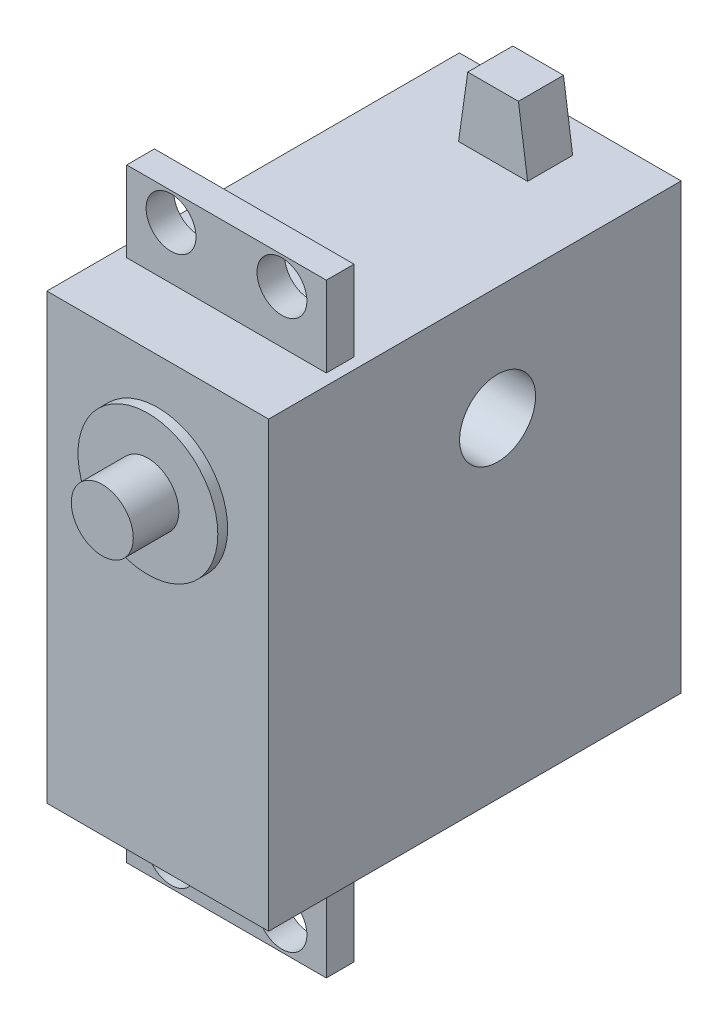
ISO-10303-21;
HEADER;
FILE_DESCRIPTION(('STEP AP214'),'2;1');
FILE_NAME('part.step','',(''),(''),'','','');
FILE_SCHEMA(('AUTOMOTIVE_DESIGN { 1 0 10303 214 1 1 1 1 }'));
ENDSEC;
DATA;
#1=APPLICATION_CONTEXT('core data for automotive mechanical design processes');
#2=APPLICATION_PROTOCOL_DEFINITION('international standard','automotive_design',2000,#1);
#3=PRODUCT_CONTEXT('',#1,'mechanical');
#4=PRODUCT('Part','Part','',(#3));
#5=PRODUCT_RELATED_PRODUCT_CATEGORY('part','',(#4));
#6=PRODUCT_DEFINITION_FORMATION('','',#4);
#7=PRODUCT_DEFINITION_CONTEXT('part definition',#1,'design');
#8=PRODUCT_DEFINITION('design','',#6,#7);
#9=PRODUCT_DEFINITION_SHAPE('','',#8);
#10=(LENGTH_UNIT() NAMED_UNIT(*) SI_UNIT(.MILLI.,.METRE.));
#11=(NAMED_UNIT(*) PLANE_ANGLE_UNIT() SI_UNIT($,.RADIAN.));
#12=(NAMED_UNIT(*) SI_UNIT($,.STERADIAN.) SOLID_ANGLE_UNIT());
#13=UNCERTAINTY_MEASURE_WITH_UNIT(LENGTH_MEASURE(1.E-05),#10,'distance_accuracy_value','');
#14=(GEOMETRIC_REPRESENTATION_CONTEXT(3) GLOBAL_UNCERTAINTY_ASSIGNED_CONTEXT((#13)) GLOBAL_UNIT_ASSIGNED_CONTEXT((#10,
#11,#12)) REPRESENTATION_CONTEXT('',''));
#15=CARTESIAN_POINT('',(0.,0.,0.));
#16=DIRECTION('',(0.,0.,1.));
#17=DIRECTION('',(1.,0.,0.));
#18=AXIS2_PLACEMENT_3D('',#15,#16,#17);
#19=CARTESIAN_POINT('',(0.,0.,8.7));
#20=DIRECTION('',(0.,0.,1.));
#21=DIRECTION('',(1.,0.,0.));
#22=AXIS2_PLACEMENT_3D('',#19,#20,#21);
#23=PLANE('',#22);
#24=CARTESIAN_POINT('',(10.,29.6,8.7));
#25=DIRECTION('',(0.,0.,1.));
#26=DIRECTION('',(1.,0.,0.));
#27=AXIS2_PLACEMENT_3D('',#24,#25,#26);
#28=CIRCLE('',#27,6.30555);
#29=CARTESIAN_POINT('',(16.30555,29.6,8.7));
#30=VERTEX_POINT('',#29);
#31=EDGE_CURVE('E369',#30,#30,#28,.T.);
#32=ORIENTED_EDGE('',*,*,#31,.F.);
#33=EDGE_LOOP('',(#32));
#34=FACE_BOUND('',#33,.T.);
#35=DIRECTION('',(0.,-1.,0.));
#36=VECTOR('',#35,1.);
#37=CARTESIAN_POINT('',(0.,40.,8.7));
#38=LINE('',#37,#36);
#39=CARTESIAN_POINT('',(0.,40.,8.7));
#40=VERTEX_POINT('',#39);
#41=CARTESIAN_POINT('',(0.,0.,8.7));
#42=VERTEX_POINT('',#41);
#43=EDGE_CURVE('E272',#40,#42,#38,.T.);
#44=ORIENTED_EDGE('',*,*,#43,.T.);
#45=DIRECTION('',(1.,0.,0.));
#46=VECTOR('',#45,1.);
#47=CARTESIAN_POINT('',(0.,0.,8.7));
#48=LINE('',#47,#46);
#49=CARTESIAN_POINT('',(20.,0.,8.7));
#50=VERTEX_POINT('',#49);
#51=EDGE_CURVE('E275',#42,#50,#48,.T.);
#52=ORIENTED_EDGE('',*,*,#51,.T.);
#53=DIRECTION('',(0.,1.,0.));
#54=VECTOR('',#53,1.);
#55=CARTESIAN_POINT('',(20.,40.,8.7));
#56=LINE('',#55,#54);
#57=CARTESIAN_POINT('',(20.,40.,8.7));
#58=VERTEX_POINT('',#57);
#59=EDGE_CURVE('E277',#50,#58,#56,.T.);
#60=ORIENTED_EDGE('',*,*,#59,.T.);
#61=DIRECTION('',(-1.,0.,0.));
#62=VECTOR('',#61,1.);
#63=CARTESIAN_POINT('',(0.,40.,8.7));
#64=LINE('',#63,#62);
#65=EDGE_CURVE('E279',#58,#40,#64,.T.);
#66=ORIENTED_EDGE('',*,*,#65,.T.);
#67=EDGE_LOOP('',(#44,#52,#60,#66));
#68=FACE_BOUND('',#67,.T.);
#69=ADVANCED_FACE('F37',(#34,#68),#23,.T.);
#70=CARTESIAN_POINT('',(0.,40.,8.7));
#71=DIRECTION('',(1.,0.,0.));
#72=DIRECTION('',(0.,1.,0.));
#73=AXIS2_PLACEMENT_3D('',#70,#71,#72);
#74=PLANE('',#73);
#75=CARTESIAN_POINT('',(0.,29.7526891788813,-11.9458323275019));
#76=DIRECTION('',(1.,0.,0.));
#77=DIRECTION('',(0.,1.,0.));
#78=AXIS2_PLACEMENT_3D('',#75,#76,#77);
#79=CIRCLE('',#78,3.42456653752331);
#80=CARTESIAN_POINT('',(0.,33.1772557164046,-11.9458323275019));
#81=VERTEX_POINT('',#80);
#82=EDGE_CURVE('E158',#81,#81,#79,.F.);
#83=ORIENTED_EDGE('',*,*,#82,.F.);
#84=EDGE_LOOP('',(#83));
#85=FACE_BOUND('',#84,.T.);
#86=DIRECTION('',(0.,0.,-1.));
#87=VECTOR('',#86,1.);
#88=CARTESIAN_POINT('',(0.,40.,8.7));
#89=LINE('',#88,#87);
#90=CARTESIAN_POINT('',(0.,40.,-28.5));
#91=VERTEX_POINT('',#90);
#92=EDGE_CURVE('E281',#40,#91,#89,.T.);
#93=ORIENTED_EDGE('',*,*,#92,.T.);
#94=DIRECTION('',(0.,1.,0.));
#95=VECTOR('',#94,1.);
#96=CARTESIAN_POINT('',(0.,40.,-28.5));
#97=LINE('',#96,#95);
#98=CARTESIAN_POINT('',(0.,0.,-28.5));
#99=VERTEX_POINT('',#98);
#100=EDGE_CURVE('E267',#99,#91,#97,.T.);
#101=ORIENTED_EDGE('',*,*,#100,.F.);
#102=DIRECTION('',(0.,0.,-1.));
#103=VECTOR('',#102,1.);
#104=CARTESIAN_POINT('',(0.,0.,8.7));
#105=LINE('',#104,#103);
#106=EDGE_CURVE('E288',#42,#99,#105,.T.);
#107=ORIENTED_EDGE('',*,*,#106,.F.);
#108=ORIENTED_EDGE('',*,*,#43,.F.);
#109=EDGE_LOOP('',(#93,#101,#107,#108));
#110=FACE_BOUND('',#109,.T.);
#111=ADVANCED_FACE('F39',(#85,#110),#74,.F.);
#112=CARTESIAN_POINT('',(0.,0.,8.7));
#113=DIRECTION('',(0.,1.,0.));
#114=DIRECTION('',(0.,0.,1.));
#115=AXIS2_PLACEMENT_3D('',#112,#113,#114);
#116=PLANE('',#115);
#117=DIRECTION('',(0.,0.,-1.));
#118=VECTOR('',#117,1.);
#119=CARTESIAN_POINT('',(1.,0.,2.5));
#120=LINE('',#119,#118);
#121=CARTESIAN_POINT('',(1.,0.,2.5));
#122=VERTEX_POINT('',#121);
#123=CARTESIAN_POINT('',(1.,0.,0.));
#124=VERTEX_POINT('',#123);
#125=EDGE_CURVE('E57',#122,#124,#120,.T.);
#126=ORIENTED_EDGE('',*,*,#125,.F.);
#127=DIRECTION('',(1.,0.,0.));
#128=VECTOR('',#127,1.);
#129=CARTESIAN_POINT('',(0.,0.,2.5));
#130=LINE('',#129,#128);
#131=CARTESIAN_POINT('',(19.,0.,2.5));
#132=VERTEX_POINT('',#131);
#133=EDGE_CURVE('E259',#122,#132,#130,.T.);
#134=ORIENTED_EDGE('',*,*,#133,.T.);
#135=DIRECTION('',(0.,0.,-1.));
#136=VECTOR('',#135,1.);
#137=CARTESIAN_POINT('',(19.,0.,2.5));
#138=LINE('',#137,#136);
#139=CARTESIAN_POINT('',(19.,0.,0.));
#140=VERTEX_POINT('',#139);
#141=EDGE_CURVE('E226',#132,#140,#138,.T.);
#142=ORIENTED_EDGE('',*,*,#141,.T.);
#143=DIRECTION('',(1.,0.,0.));
#144=VECTOR('',#143,1.);
#145=CARTESIAN_POINT('',(0.,0.,0.));
#146=LINE('',#145,#144);
#147=EDGE_CURVE('E53',#124,#140,#146,.T.);
#148=ORIENTED_EDGE('',*,*,#147,.F.);
#149=EDGE_LOOP('',(#126,#134,#142,#148));
#150=FACE_BOUND('',#149,.T.);
#151=ORIENTED_EDGE('',*,*,#106,.T.);
#152=DIRECTION('',(-1.,0.,0.));
#153=VECTOR('',#152,1.);
#154=CARTESIAN_POINT('',(20.,0.,-28.5));
#155=LINE('',#154,#153);
#156=CARTESIAN_POINT('',(20.,0.,-28.5));
#157=VERTEX_POINT('',#156);
#158=EDGE_CURVE('E264',#157,#99,#155,.T.);
#159=ORIENTED_EDGE('',*,*,#158,.F.);
#160=DIRECTION('',(0.,0.,-1.));
#161=VECTOR('',#160,1.);
#162=CARTESIAN_POINT('',(20.,0.,8.7));
#163=LINE('',#162,#161);
#164=EDGE_CURVE('E286',#50,#157,#163,.T.);
#165=ORIENTED_EDGE('',*,*,#164,.F.);
#166=ORIENTED_EDGE('',*,*,#51,.F.);
#167=EDGE_LOOP('',(#151,#159,#165,#166));
#168=FACE_BOUND('',#167,.T.);
#169=ADVANCED_FACE('F334',(#150,#168),#116,.F.);
#170=CARTESIAN_POINT('',(20.,40.,8.7));
#171=DIRECTION('',(-1.,0.,0.));
#172=DIRECTION('',(0.,0.,1.));
#173=AXIS2_PLACEMENT_3D('',#170,#171,#172);
#174=PLANE('',#173);
#175=CARTESIAN_POINT('',(20.,29.7526891788813,-11.9458323275019));
#176=DIRECTION('',(1.,0.,0.));
#177=DIRECTION('',(0.,0.,-1.));
#178=AXIS2_PLACEMENT_3D('',#175,#176,#177);
#179=CIRCLE('',#178,3.42456653752331);
#180=CARTESIAN_POINT('',(20.,29.7526891788813,-15.3703988650252));
#181=VERTEX_POINT('',#180);
#182=EDGE_CURVE('E625',#181,#181,#179,.T.);
#183=ORIENTED_EDGE('',*,*,#182,.F.);
#184=EDGE_LOOP('',(#183));
#185=FACE_BOUND('',#184,.T.);
#186=ORIENTED_EDGE('',*,*,#164,.T.);
#187=DIRECTION('',(0.,-1.,0.));
#188=VECTOR('',#187,1.);
#189=CARTESIAN_POINT('',(20.,40.,-28.5));
#190=LINE('',#189,#188);
#191=CARTESIAN_POINT('',(20.,40.,-28.5));
#192=VERTEX_POINT('',#191);
#193=EDGE_CURVE('E261',#192,#157,#190,.T.);
#194=ORIENTED_EDGE('',*,*,#193,.F.);
#195=DIRECTION('',(0.,0.,-1.));
#196=VECTOR('',#195,1.);
#197=CARTESIAN_POINT('',(20.,40.,8.7));
#198=LINE('',#197,#196);
#199=EDGE_CURVE('E283',#58,#192,#198,.T.);
#200=ORIENTED_EDGE('',*,*,#199,.F.);
#201=ORIENTED_EDGE('',*,*,#59,.F.);
#202=EDGE_LOOP('',(#186,#194,#200,#201));
#203=FACE_BOUND('',#202,.T.);
#204=ADVANCED_FACE('F344',(#185,#203),#174,.F.);
#205=CARTESIAN_POINT('',(0.,40.,8.7));
#206=DIRECTION('',(0.,-1.,0.));
#207=DIRECTION('',(1.,0.,0.));
#208=AXIS2_PLACEMENT_3D('',#205,#206,#207);
#209=PLANE('',#208);
#210=ORIENTED_EDGE('',*,*,#199,.T.);
#211=DIRECTION('',(1.,0.,0.));
#212=VECTOR('',#211,1.);
#213=CARTESIAN_POINT('',(20.,40.,-28.5));
#214=LINE('',#213,#212);
#215=EDGE_CURVE('E270',#91,#192,#214,.T.);
#216=ORIENTED_EDGE('',*,*,#215,.F.);
#217=ORIENTED_EDGE('',*,*,#92,.F.);
#218=ORIENTED_EDGE('',*,*,#65,.F.);
#219=EDGE_LOOP('',(#210,#216,#217,#218));
#220=FACE_BOUND('',#219,.T.);
#221=DIRECTION('',(-1.,0.,0.));
#222=VECTOR('',#221,1.);
#223=CARTESIAN_POINT('',(6.8885,40.,-25.6044));
#224=LINE('',#223,#222);
#225=CARTESIAN_POINT('',(13.1115,40.,-25.6044));
#226=VERTEX_POINT('',#225);
#227=CARTESIAN_POINT('',(6.8885,40.,-25.6044));
#228=VERTEX_POINT('',#227);
#229=EDGE_CURVE('E167',#226,#228,#224,.T.);
#230=ORIENTED_EDGE('',*,*,#229,.F.);
#231=DIRECTION('',(0.,0.,-1.));
#232=VECTOR('',#231,1.);
#233=CARTESIAN_POINT('',(13.1115,40.,-21.5404));
#234=LINE('',#233,#232);
#235=CARTESIAN_POINT('',(13.1115,40.,-21.5404));
#236=VERTEX_POINT('',#235);
#237=EDGE_CURVE('E166',#236,#226,#234,.T.);
#238=ORIENTED_EDGE('',*,*,#237,.F.);
#239=DIRECTION('',(-1.,0.,0.));
#240=VECTOR('',#239,1.);
#241=CARTESIAN_POINT('',(13.1115,40.,-21.5404));
#242=LINE('',#241,#240);
#243=CARTESIAN_POINT('',(6.8885,40.,-21.5404));
#244=VERTEX_POINT('',#243);
#245=EDGE_CURVE('E379',#236,#244,#242,.T.);
#246=ORIENTED_EDGE('',*,*,#245,.T.);
#247=DIRECTION('',(0.,0.,-1.));
#248=VECTOR('',#247,1.);
#249=CARTESIAN_POINT('',(6.8885,40.,-21.5404));
#250=LINE('',#249,#248);
#251=EDGE_CURVE('E179',#244,#228,#250,.T.);
#252=ORIENTED_EDGE('',*,*,#251,.T.);
#253=EDGE_LOOP('',(#230,#238,#246,#252));
#254=FACE_BOUND('',#253,.T.);
#255=DIRECTION('',(0.,0.,-1.));
#256=VECTOR('',#255,1.);
#257=CARTESIAN_POINT('',(19.,40.,2.5));
#258=LINE('',#257,#256);
#259=CARTESIAN_POINT('',(19.,40.,2.5));
#260=VERTEX_POINT('',#259);
#261=CARTESIAN_POINT('',(19.,40.,0.));
#262=VERTEX_POINT('',#261);
#263=EDGE_CURVE('E255',#260,#262,#258,.T.);
#264=ORIENTED_EDGE('',*,*,#263,.F.);
#265=DIRECTION('',(-1.,0.,0.));
#266=VECTOR('',#265,1.);
#267=CARTESIAN_POINT('',(0.,40.,2.5));
#268=LINE('',#267,#266);
#269=CARTESIAN_POINT('',(0.999999999999999,40.,2.5));
#270=VERTEX_POINT('',#269);
#271=EDGE_CURVE('E12',#260,#270,#268,.T.);
#272=ORIENTED_EDGE('',*,*,#271,.T.);
#273=DIRECTION('',(0.,0.,-1.));
#274=VECTOR('',#273,1.);
#275=CARTESIAN_POINT('',(0.999999999999999,40.,2.5));
#276=LINE('',#275,#274);
#277=CARTESIAN_POINT('',(0.999999999999999,40.,0.));
#278=VERTEX_POINT('',#277);
#279=EDGE_CURVE('E247',#270,#278,#276,.T.);
#280=ORIENTED_EDGE('',*,*,#279,.T.);
#281=DIRECTION('',(-1.,0.,0.));
#282=VECTOR('',#281,1.);
#283=CARTESIAN_POINT('',(0.,40.,0.));
#284=LINE('',#283,#282);
#285=EDGE_CURVE('E46',#262,#278,#284,.T.);
#286=ORIENTED_EDGE('',*,*,#285,.F.);
#287=EDGE_LOOP('',(#264,#272,#280,#286));
#288=FACE_BOUND('',#287,.T.);
#289=ADVANCED_FACE('F310',(#220,#254,#288),#209,.F.);
#290=CARTESIAN_POINT('',(0.,0.,-28.5));
#291=DIRECTION('',(0.,0.,-1.));
#292=DIRECTION('',(-1.,0.,0.));
#293=AXIS2_PLACEMENT_3D('',#290,#291,#292);
#294=PLANE('',#293);
#295=ORIENTED_EDGE('',*,*,#215,.T.);
#296=ORIENTED_EDGE('',*,*,#193,.T.);
#297=ORIENTED_EDGE('',*,*,#158,.T.);
#298=ORIENTED_EDGE('',*,*,#100,.T.);
#299=EDGE_LOOP('',(#295,#296,#297,#298));
#300=FACE_BOUND('',#299,.T.);
#301=ADVANCED_FACE('F340',(#300),#294,.T.);
#302=CARTESIAN_POINT('',(5.,44.75,2.5));
#303=DIRECTION('',(0.,0.,-1.));
#304=DIRECTION('',(-1.,0.,0.));
#305=AXIS2_PLACEMENT_3D('',#302,#303,#304);
#306=CYLINDRICAL_SURFACE('',#305,2.25);
#307=CARTESIAN_POINT('',(5.,44.75,2.5));
#308=DIRECTION('',(0.,0.,1.));
#309=DIRECTION('',(1.,0.,0.));
#310=AXIS2_PLACEMENT_3D('',#307,#308,#309);
#311=CIRCLE('',#310,2.25);
#312=CARTESIAN_POINT('',(7.25,44.75,2.5));
#313=VERTEX_POINT('',#312);
#314=EDGE_CURVE('E193',#313,#313,#311,.T.);
#315=ORIENTED_EDGE('',*,*,#314,.T.);
#316=EDGE_LOOP('',(#315));
#317=FACE_BOUND('',#316,.T.);
#318=CARTESIAN_POINT('',(5.,44.75,0.));
#319=DIRECTION('',(0.,0.,1.));
#320=DIRECTION('',(1.,0.,0.));
#321=AXIS2_PLACEMENT_3D('',#318,#319,#320);
#322=CIRCLE('',#321,2.25);
#323=CARTESIAN_POINT('',(7.25,44.75,0.));
#324=VERTEX_POINT('',#323);
#325=EDGE_CURVE('E190',#324,#324,#322,.T.);
#326=ORIENTED_EDGE('',*,*,#325,.F.);
#327=EDGE_LOOP('',(#326));
#328=FACE_BOUND('',#327,.T.);
#329=ADVANCED_FACE('F416',(#317,#328),#306,.F.);
#330=CARTESIAN_POINT('',(15.,44.75,2.5));
#331=DIRECTION('',(0.,0.,-1.));
#332=DIRECTION('',(-1.,0.,0.));
#333=AXIS2_PLACEMENT_3D('',#330,#331,#332);
#334=CYLINDRICAL_SURFACE('',#333,2.25);
#335=CARTESIAN_POINT('',(15.,44.75,2.5));
#336=DIRECTION('',(0.,0.,1.));
#337=DIRECTION('',(1.,0.,0.));
#338=AXIS2_PLACEMENT_3D('',#335,#336,#337);
#339=CIRCLE('',#338,2.25);
#340=CARTESIAN_POINT('',(17.25,44.75,2.5));
#341=VERTEX_POINT('',#340);
#342=EDGE_CURVE('E187',#341,#341,#339,.T.);
#343=ORIENTED_EDGE('',*,*,#342,.T.);
#344=EDGE_LOOP('',(#343));
#345=FACE_BOUND('',#344,.T.);
#346=CARTESIAN_POINT('',(15.,44.75,0.));
#347=DIRECTION('',(0.,0.,1.));
#348=DIRECTION('',(1.,0.,0.));
#349=AXIS2_PLACEMENT_3D('',#346,#347,#348);
#350=CIRCLE('',#349,2.25);
#351=CARTESIAN_POINT('',(17.25,44.75,0.));
#352=VERTEX_POINT('',#351);
#353=EDGE_CURVE('E177',#352,#352,#350,.T.);
#354=ORIENTED_EDGE('',*,*,#353,.F.);
#355=EDGE_LOOP('',(#354));
#356=FACE_BOUND('',#355,.T.);
#357=ADVANCED_FACE('F413',(#345,#356),#334,.F.);
#358=CARTESIAN_POINT('',(1.,47.25,2.5));
#359=DIRECTION('',(0.,-1.,0.));
#360=DIRECTION('',(0.,0.,-1.));
#361=AXIS2_PLACEMENT_3D('',#358,#359,#360);
#362=PLANE('',#361);
#363=DIRECTION('',(-1.,0.,0.));
#364=VECTOR('',#363,1.);
#365=CARTESIAN_POINT('',(1.,47.25,0.));
#366=LINE('',#365,#364);
#367=CARTESIAN_POINT('',(19.,47.25,0.));
#368=VERTEX_POINT('',#367);
#369=CARTESIAN_POINT('',(1.,47.25,0.));
#370=VERTEX_POINT('',#369);
#371=EDGE_CURVE('E228',#368,#370,#366,.T.);
#372=ORIENTED_EDGE('',*,*,#371,.T.);
#373=DIRECTION('',(0.,0.,-1.));
#374=VECTOR('',#373,1.);
#375=CARTESIAN_POINT('',(1.,47.25,2.5));
#376=LINE('',#375,#374);
#377=CARTESIAN_POINT('',(1.,47.25,2.5));
#378=VERTEX_POINT('',#377);
#379=EDGE_CURVE('E249',#378,#370,#376,.T.);
#380=ORIENTED_EDGE('',*,*,#379,.F.);
#381=DIRECTION('',(-1.,0.,0.));
#382=VECTOR('',#381,1.);
#383=CARTESIAN_POINT('',(1.,47.25,2.5));
#384=LINE('',#383,#382);
#385=CARTESIAN_POINT('',(19.,47.25,2.5));
#386=VERTEX_POINT('',#385);
#387=EDGE_CURVE('E213',#386,#378,#384,.T.);
#388=ORIENTED_EDGE('',*,*,#387,.F.);
#389=DIRECTION('',(0.,0.,-1.));
#390=VECTOR('',#389,1.);
#391=CARTESIAN_POINT('',(19.,47.25,2.5));
#392=LINE('',#391,#390);
#393=EDGE_CURVE('E252',#386,#368,#392,.T.);
#394=ORIENTED_EDGE('',*,*,#393,.T.);
#395=EDGE_LOOP('',(#372,#380,#388,#394));
#396=FACE_BOUND('',#395,.T.);
#397=ADVANCED_FACE('F304',(#396),#362,.F.);
#398=CARTESIAN_POINT('',(1.,47.25,2.5));
#399=DIRECTION('',(1.,0.,0.));
#400=DIRECTION('',(0.,1.,0.));
#401=AXIS2_PLACEMENT_3D('',#398,#399,#400);
#402=PLANE('',#401);
#403=DIRECTION('',(0.,-1.,0.));
#404=VECTOR('',#403,1.);
#405=CARTESIAN_POINT('',(1.,47.25,0.));
#406=LINE('',#405,#404);
#407=EDGE_CURVE('E230',#370,#278,#406,.T.);
#408=ORIENTED_EDGE('',*,*,#407,.T.);
#409=ORIENTED_EDGE('',*,*,#279,.F.);
#410=DIRECTION('',(0.,-1.,0.));
#411=VECTOR('',#410,1.);
#412=CARTESIAN_POINT('',(1.,47.25,2.5));
#413=LINE('',#412,#411);
#414=EDGE_CURVE('E216',#378,#270,#413,.T.);
#415=ORIENTED_EDGE('',*,*,#414,.F.);
#416=ORIENTED_EDGE('',*,*,#379,.T.);
#417=EDGE_LOOP('',(#408,#409,#415,#416));
#418=FACE_BOUND('',#417,.T.);
#419=ADVANCED_FACE('F299',(#418),#402,.F.);
#420=CARTESIAN_POINT('',(19.,47.25,2.5));
#421=DIRECTION('',(-1.,0.,0.));
#422=DIRECTION('',(0.,-1.,0.));
#423=AXIS2_PLACEMENT_3D('',#420,#421,#422);
#424=PLANE('',#423);
#425=DIRECTION('',(0.,1.,0.));
#426=VECTOR('',#425,1.);
#427=CARTESIAN_POINT('',(19.,47.25,0.));
#428=LINE('',#427,#426);
#429=EDGE_CURVE('E208',#262,#368,#428,.T.);
#430=ORIENTED_EDGE('',*,*,#429,.T.);
#431=ORIENTED_EDGE('',*,*,#393,.F.);
#432=DIRECTION('',(0.,1.,0.));
#433=VECTOR('',#432,1.);
#434=CARTESIAN_POINT('',(19.,47.25,2.5));
#435=LINE('',#434,#433);
#436=EDGE_CURVE('E211',#260,#386,#435,.T.);
#437=ORIENTED_EDGE('',*,*,#436,.F.);
#438=ORIENTED_EDGE('',*,*,#263,.T.);
#439=EDGE_LOOP('',(#430,#431,#437,#438));
#440=FACE_BOUND('',#439,.T.);
#441=ADVANCED_FACE('F308',(#440),#424,.F.);
#442=CARTESIAN_POINT('',(0.,0.,0.));
#443=DIRECTION('',(0.,0.,1.));
#444=DIRECTION('',(1.,0.,0.));
#445=AXIS2_PLACEMENT_3D('',#442,#443,#444);
#446=PLANE('',#445);
#447=ORIENTED_EDGE('',*,*,#353,.T.);
#448=EDGE_LOOP('',(#447));
#449=FACE_BOUND('',#448,.T.);
#450=ORIENTED_EDGE('',*,*,#325,.T.);
#451=EDGE_LOOP('',(#450));
#452=FACE_BOUND('',#451,.T.);
#453=ORIENTED_EDGE('',*,*,#429,.F.);
#454=ORIENTED_EDGE('',*,*,#285,.T.);
#455=ORIENTED_EDGE('',*,*,#407,.F.);
#456=ORIENTED_EDGE('',*,*,#371,.F.);
#457=EDGE_LOOP('',(#453,#454,#455,#456));
#458=FACE_BOUND('',#457,.T.);
#459=ADVANCED_FACE('F294',(#449,#452,#458),#446,.F.);
#460=CARTESIAN_POINT('',(0.,0.,2.5));
#461=DIRECTION('',(0.,0.,1.));
#462=DIRECTION('',(1.,0.,0.));
#463=AXIS2_PLACEMENT_3D('',#460,#461,#462);
#464=PLANE('',#463);
#465=ORIENTED_EDGE('',*,*,#342,.F.);
#466=EDGE_LOOP('',(#465));
#467=FACE_BOUND('',#466,.T.);
#468=ORIENTED_EDGE('',*,*,#314,.F.);
#469=EDGE_LOOP('',(#468));
#470=FACE_BOUND('',#469,.T.);
#471=ORIENTED_EDGE('',*,*,#271,.F.);
#472=ORIENTED_EDGE('',*,*,#436,.T.);
#473=ORIENTED_EDGE('',*,*,#387,.T.);
#474=ORIENTED_EDGE('',*,*,#414,.T.);
#475=EDGE_LOOP('',(#471,#472,#473,#474));
#476=FACE_BOUND('',#475,.T.);
#477=ADVANCED_FACE('F312',(#467,#470,#476),#464,.T.);
#478=CARTESIAN_POINT('',(15.,-4.75,2.5));
#479=DIRECTION('',(0.,0.,1.));
#480=DIRECTION('',(1.,0.,0.));
#481=AXIS2_PLACEMENT_3D('',#478,#479,#480);
#482=CIRCLE('',#481,2.25);
#483=CARTESIAN_POINT('',(17.25,-4.75,2.5));
#484=VERTEX_POINT('',#483);
#485=EDGE_CURVE('E199',#484,#484,#482,.T.);
#486=ORIENTED_EDGE('',*,*,#485,.F.);
#487=EDGE_LOOP('',(#486));
#488=FACE_BOUND('',#487,.T.);
#489=CARTESIAN_POINT('',(5.,-4.75,2.5));
#490=DIRECTION('',(0.,0.,1.));
#491=DIRECTION('',(1.,0.,0.));
#492=AXIS2_PLACEMENT_3D('',#489,#490,#491);
#493=CIRCLE('',#492,2.25);
#494=CARTESIAN_POINT('',(7.25,-4.75,2.5));
#495=VERTEX_POINT('',#494);
#496=EDGE_CURVE('E205',#495,#495,#493,.T.);
#497=ORIENTED_EDGE('',*,*,#496,.F.);
#498=EDGE_LOOP('',(#497));
#499=FACE_BOUND('',#498,.T.);
#500=ORIENTED_EDGE('',*,*,#133,.F.);
#501=DIRECTION('',(0.,-1.,0.));
#502=VECTOR('',#501,1.);
#503=CARTESIAN_POINT('',(1.,0.,2.5));
#504=LINE('',#503,#502);
#505=CARTESIAN_POINT('',(0.999999999999999,-7.25,2.5));
#506=VERTEX_POINT('',#505);
#507=EDGE_CURVE('E219',#122,#506,#504,.T.);
#508=ORIENTED_EDGE('',*,*,#507,.T.);
#509=DIRECTION('',(1.,0.,0.));
#510=VECTOR('',#509,1.);
#511=CARTESIAN_POINT('',(0.999999999999999,-7.25,2.5));
#512=LINE('',#511,#510);
#513=CARTESIAN_POINT('',(19.,-7.25,2.5));
#514=VERTEX_POINT('',#513);
#515=EDGE_CURVE('E221',#506,#514,#512,.T.);
#516=ORIENTED_EDGE('',*,*,#515,.T.);
#517=DIRECTION('',(0.,1.,0.));
#518=VECTOR('',#517,1.);
#519=CARTESIAN_POINT('',(19.,0.,2.5));
#520=LINE('',#519,#518);
#521=EDGE_CURVE('E223',#514,#132,#520,.T.);
#522=ORIENTED_EDGE('',*,*,#521,.T.);
#523=EDGE_LOOP('',(#500,#508,#516,#522));
#524=FACE_BOUND('',#523,.T.);
#525=ADVANCED_FACE('F314',(#488,#499,#524),#464,.T.);
#526=CARTESIAN_POINT('',(5.,-4.75,0.));
#527=DIRECTION('',(0.,0.,1.));
#528=DIRECTION('',(1.,0.,0.));
#529=AXIS2_PLACEMENT_3D('',#526,#527,#528);
#530=CIRCLE('',#529,2.25);
#531=CARTESIAN_POINT('',(7.25,-4.75,0.));
#532=VERTEX_POINT('',#531);
#533=EDGE_CURVE('E202',#532,#532,#530,.T.);
#534=ORIENTED_EDGE('',*,*,#533,.T.);
#535=EDGE_LOOP('',(#534));
#536=FACE_BOUND('',#535,.T.);
#537=CARTESIAN_POINT('',(15.,-4.75,0.));
#538=DIRECTION('',(0.,0.,1.));
#539=DIRECTION('',(1.,0.,0.));
#540=AXIS2_PLACEMENT_3D('',#537,#538,#539);
#541=CIRCLE('',#540,2.25);
#542=CARTESIAN_POINT('',(17.25,-4.75,0.));
#543=VERTEX_POINT('',#542);
#544=EDGE_CURVE('E196',#543,#543,#541,.T.);
#545=ORIENTED_EDGE('',*,*,#544,.T.);
#546=EDGE_LOOP('',(#545));
#547=FACE_BOUND('',#546,.T.);
#548=DIRECTION('',(0.,-1.,0.));
#549=VECTOR('',#548,1.);
#550=CARTESIAN_POINT('',(1.,0.,0.));
#551=LINE('',#550,#549);
#552=CARTESIAN_POINT('',(0.999999999999999,-7.25,0.));
#553=VERTEX_POINT('',#552);
#554=EDGE_CURVE('E233',#124,#553,#551,.T.);
#555=ORIENTED_EDGE('',*,*,#554,.F.);
#556=ORIENTED_EDGE('',*,*,#147,.T.);
#557=DIRECTION('',(0.,1.,0.));
#558=VECTOR('',#557,1.);
#559=CARTESIAN_POINT('',(19.,0.,0.));
#560=LINE('',#559,#558);
#561=CARTESIAN_POINT('',(19.,-7.25,0.));
#562=VERTEX_POINT('',#561);
#563=EDGE_CURVE('E214',#562,#140,#560,.T.);
#564=ORIENTED_EDGE('',*,*,#563,.F.);
#565=DIRECTION('',(1.,0.,0.));
#566=VECTOR('',#565,1.);
#567=CARTESIAN_POINT('',(0.999999999999999,-7.25,0.));
#568=LINE('',#567,#566);
#569=EDGE_CURVE('E235',#553,#562,#568,.T.);
#570=ORIENTED_EDGE('',*,*,#569,.F.);
#571=EDGE_LOOP('',(#555,#556,#564,#570));
#572=FACE_BOUND('',#571,.T.);
#573=ADVANCED_FACE('F321',(#536,#547,#572),#446,.F.);
#574=CARTESIAN_POINT('',(1.,0.,2.5));
#575=DIRECTION('',(1.,0.,0.));
#576=DIRECTION('',(0.,1.,0.));
#577=AXIS2_PLACEMENT_3D('',#574,#575,#576);
#578=PLANE('',#577);
#579=ORIENTED_EDGE('',*,*,#554,.T.);
#580=DIRECTION('',(0.,0.,-1.));
#581=VECTOR('',#580,1.);
#582=CARTESIAN_POINT('',(0.999999999999999,-7.25,2.5));
#583=LINE('',#582,#581);
#584=EDGE_CURVE('E243',#506,#553,#583,.T.);
#585=ORIENTED_EDGE('',*,*,#584,.F.);
#586=ORIENTED_EDGE('',*,*,#507,.F.);
#587=ORIENTED_EDGE('',*,*,#125,.T.);
#588=EDGE_LOOP('',(#579,#585,#586,#587));
#589=FACE_BOUND('',#588,.T.);
#590=ADVANCED_FACE('F439',(#589),#578,.F.);
#591=CARTESIAN_POINT('',(0.999999999999999,-7.25,2.5));
#592=DIRECTION('',(0.,1.,0.));
#593=DIRECTION('',(0.,0.,1.));
#594=AXIS2_PLACEMENT_3D('',#591,#592,#593);
#595=PLANE('',#594);
#596=ORIENTED_EDGE('',*,*,#569,.T.);
#597=DIRECTION('',(0.,0.,-1.));
#598=VECTOR('',#597,1.);
#599=CARTESIAN_POINT('',(19.,-7.25,2.5));
#600=LINE('',#599,#598);
#601=EDGE_CURVE('E240',#514,#562,#600,.T.);
#602=ORIENTED_EDGE('',*,*,#601,.F.);
#603=ORIENTED_EDGE('',*,*,#515,.F.);
#604=ORIENTED_EDGE('',*,*,#584,.T.);
#605=EDGE_LOOP('',(#596,#602,#603,#604));
#606=FACE_BOUND('',#605,.T.);
#607=ADVANCED_FACE('F430',(#606),#595,.F.);
#608=CARTESIAN_POINT('',(19.,0.,2.5));
#609=DIRECTION('',(-1.,0.,0.));
#610=DIRECTION('',(0.,0.,1.));
#611=AXIS2_PLACEMENT_3D('',#608,#609,#610);
#612=PLANE('',#611);
#613=ORIENTED_EDGE('',*,*,#563,.T.);
#614=ORIENTED_EDGE('',*,*,#141,.F.);
#615=ORIENTED_EDGE('',*,*,#521,.F.);
#616=ORIENTED_EDGE('',*,*,#601,.T.);
#617=EDGE_LOOP('',(#613,#614,#615,#616));
#618=FACE_BOUND('',#617,.T.);
#619=ADVANCED_FACE('F425',(#618),#612,.F.);
#620=CARTESIAN_POINT('',(5.,-4.75,2.5));
#621=DIRECTION('',(0.,0.,-1.));
#622=DIRECTION('',(-1.,0.,0.));
#623=AXIS2_PLACEMENT_3D('',#620,#621,#622);
#624=CYLINDRICAL_SURFACE('',#623,2.25);
#625=ORIENTED_EDGE('',*,*,#496,.T.);
#626=EDGE_LOOP('',(#625));
#627=FACE_BOUND('',#626,.T.);
#628=ORIENTED_EDGE('',*,*,#533,.F.);
#629=EDGE_LOOP('',(#628));
#630=FACE_BOUND('',#629,.T.);
#631=ADVANCED_FACE('F422',(#627,#630),#624,.F.);
#632=CARTESIAN_POINT('',(15.,-4.75,2.5));
#633=DIRECTION('',(0.,0.,-1.));
#634=DIRECTION('',(-1.,0.,0.));
#635=AXIS2_PLACEMENT_3D('',#632,#633,#634);
#636=CYLINDRICAL_SURFACE('',#635,2.25);
#637=ORIENTED_EDGE('',*,*,#485,.T.);
#638=EDGE_LOOP('',(#637));
#639=FACE_BOUND('',#638,.T.);
#640=ORIENTED_EDGE('',*,*,#544,.F.);
#641=EDGE_LOOP('',(#640));
#642=FACE_BOUND('',#641,.T.);
#643=ADVANCED_FACE('F404',(#639,#642),#636,.F.);
#644=CARTESIAN_POINT('',(13.1115,40.,-21.5404));
#645=DIRECTION('',(0.990163599913086,0.139914421726849,0.));
#646=DIRECTION('',(-0.139914421726849,0.990163599913086,0.));
#647=AXIS2_PLACEMENT_3D('',#644,#645,#646);
#648=PLANE('',#647);
#649=DIRECTION('',(0.139914421726849,-0.990163599913086,0.));
#650=VECTOR('',#649,1.);
#651=CARTESIAN_POINT('',(13.1115,40.,-25.6044));
#652=LINE('',#651,#650);
#653=CARTESIAN_POINT('',(12.286,45.842,-25.6044));
#654=VERTEX_POINT('',#653);
#655=EDGE_CURVE('E151',#654,#226,#652,.T.);
#656=ORIENTED_EDGE('',*,*,#655,.F.);
#657=DIRECTION('',(0.,0.,-1.));
#658=VECTOR('',#657,1.);
#659=CARTESIAN_POINT('',(12.286,45.842,-21.5404));
#660=LINE('',#659,#658);
#661=CARTESIAN_POINT('',(12.286,45.842,-21.5404));
#662=VERTEX_POINT('',#661);
#663=EDGE_CURVE('E163',#662,#654,#660,.T.);
#664=ORIENTED_EDGE('',*,*,#663,.F.);
#665=DIRECTION('',(0.139914421726849,-0.990163599913086,0.));
#666=VECTOR('',#665,1.);
#667=CARTESIAN_POINT('',(13.1115,40.,-21.5404));
#668=LINE('',#667,#666);
#669=EDGE_CURVE('E377',#662,#236,#668,.T.);
#670=ORIENTED_EDGE('',*,*,#669,.T.);
#671=ORIENTED_EDGE('',*,*,#237,.T.);
#672=EDGE_LOOP('',(#656,#664,#670,#671));
#673=FACE_BOUND('',#672,.T.);
#674=ADVANCED_FACE('F161',(#673),#648,.T.);
#675=CARTESIAN_POINT('',(12.286,45.842,-21.5404));
#676=DIRECTION('',(0.,1.,0.));
#677=DIRECTION('',(0.,0.,1.));
#678=AXIS2_PLACEMENT_3D('',#675,#676,#677);
#679=PLANE('',#678);
#680=DIRECTION('',(1.,0.,0.));
#681=VECTOR('',#680,1.);
#682=CARTESIAN_POINT('',(12.286,45.842,-25.6044));
#683=LINE('',#682,#681);
#684=CARTESIAN_POINT('',(7.714,45.842,-25.6044));
#685=VERTEX_POINT('',#684);
#686=EDGE_CURVE('E148',#685,#654,#683,.T.);
#687=ORIENTED_EDGE('',*,*,#686,.F.);
#688=DIRECTION('',(0.,0.,-1.));
#689=VECTOR('',#688,1.);
#690=CARTESIAN_POINT('',(7.714,45.842,-21.5404));
#691=LINE('',#690,#689);
#692=CARTESIAN_POINT('',(7.714,45.842,-21.5404));
#693=VERTEX_POINT('',#692);
#694=EDGE_CURVE('E174',#693,#685,#691,.T.);
#695=ORIENTED_EDGE('',*,*,#694,.F.);
#696=DIRECTION('',(1.,0.,0.));
#697=VECTOR('',#696,1.);
#698=CARTESIAN_POINT('',(12.286,45.842,-21.5404));
#699=LINE('',#698,#697);
#700=EDGE_CURVE('E172',#693,#662,#699,.T.);
#701=ORIENTED_EDGE('',*,*,#700,.T.);
#702=ORIENTED_EDGE('',*,*,#663,.T.);
#703=EDGE_LOOP('',(#687,#695,#701,#702));
#704=FACE_BOUND('',#703,.T.);
#705=ADVANCED_FACE('F170',(#704),#679,.T.);
#706=CARTESIAN_POINT('',(6.8885,40.,-21.5404));
#707=DIRECTION('',(-0.990163599913086,0.139914421726849,0.));
#708=DIRECTION('',(-0.139914421726849,-0.990163599913086,0.));
#709=AXIS2_PLACEMENT_3D('',#706,#707,#708);
#710=PLANE('',#709);
#711=DIRECTION('',(0.139914421726849,0.990163599913086,0.));
#712=VECTOR('',#711,1.);
#713=CARTESIAN_POINT('',(7.714,45.842,-25.6044));
#714=LINE('',#713,#712);
#715=EDGE_CURVE('E154',#228,#685,#714,.T.);
#716=ORIENTED_EDGE('',*,*,#715,.F.);
#717=ORIENTED_EDGE('',*,*,#251,.F.);
#718=DIRECTION('',(0.139914421726849,0.990163599913086,0.));
#719=VECTOR('',#718,1.);
#720=CARTESIAN_POINT('',(6.8885,40.,-21.5404));
#721=LINE('',#720,#719);
#722=EDGE_CURVE('E380',#244,#693,#721,.T.);
#723=ORIENTED_EDGE('',*,*,#722,.T.);
#724=ORIENTED_EDGE('',*,*,#694,.T.);
#725=EDGE_LOOP('',(#716,#717,#723,#724));
#726=FACE_BOUND('',#725,.T.);
#727=ADVANCED_FACE('F384',(#726),#710,.T.);
#728=CARTESIAN_POINT('',(0.,0.,-21.5404));
#729=DIRECTION('',(0.,0.,1.));
#730=DIRECTION('',(1.,0.,0.));
#731=AXIS2_PLACEMENT_3D('',#728,#729,#730);
#732=PLANE('',#731);
#733=ORIENTED_EDGE('',*,*,#669,.F.);
#734=ORIENTED_EDGE('',*,*,#700,.F.);
#735=ORIENTED_EDGE('',*,*,#722,.F.);
#736=ORIENTED_EDGE('',*,*,#245,.F.);
#737=EDGE_LOOP('',(#733,#734,#735,#736));
#738=FACE_BOUND('',#737,.T.);
#739=ADVANCED_FACE('F386',(#738),#732,.T.);
#740=CARTESIAN_POINT('',(10.,29.6,9.589));
#741=DIRECTION('',(0.,0.,-1.));
#742=DIRECTION('',(-1.,0.,0.));
#743=AXIS2_PLACEMENT_3D('',#740,#741,#742);
#744=CYLINDRICAL_SURFACE('',#743,6.30555);
#745=CARTESIAN_POINT('',(10.,29.6,9.589));
#746=DIRECTION('',(0.,0.,1.));
#747=DIRECTION('',(1.,0.,0.));
#748=AXIS2_PLACEMENT_3D('',#745,#746,#747);
#749=CIRCLE('',#748,6.30555);
#750=CARTESIAN_POINT('',(16.30555,29.6,9.589));
#751=VERTEX_POINT('',#750);
#752=EDGE_CURVE('E372',#751,#751,#749,.T.);
#753=ORIENTED_EDGE('',*,*,#752,.F.);
#754=EDGE_LOOP('',(#753));
#755=FACE_BOUND('',#754,.T.);
#756=ORIENTED_EDGE('',*,*,#31,.T.);
#757=EDGE_LOOP('',(#756));
#758=FACE_BOUND('',#757,.T.);
#759=ADVANCED_FACE('F388',(#755,#758),#744,.T.);
#760=CARTESIAN_POINT('',(10.,29.6,9.589));
#761=DIRECTION('',(0.,0.,1.));
#762=DIRECTION('',(1.,0.,0.));
#763=AXIS2_PLACEMENT_3D('',#760,#761,#762);
#764=PLANE('',#763);
#765=CARTESIAN_POINT('',(10.,29.6,9.589));
#766=DIRECTION('',(0.,0.,1.));
#767=DIRECTION('',(1.,0.,0.));
#768=AXIS2_PLACEMENT_3D('',#765,#766,#767);
#769=CIRCLE('',#768,2.794);
#770=CARTESIAN_POINT('',(12.794,29.6,9.589));
#771=VERTEX_POINT('',#770);
#772=EDGE_CURVE('E41',#771,#771,#769,.T.);
#773=ORIENTED_EDGE('',*,*,#772,.F.);
#774=EDGE_LOOP('',(#773));
#775=FACE_BOUND('',#774,.T.);
#776=ORIENTED_EDGE('',*,*,#752,.T.);
#777=EDGE_LOOP('',(#776));
#778=FACE_BOUND('',#777,.T.);
#779=ADVANCED_FACE('F394',(#775,#778),#764,.T.);
#780=CARTESIAN_POINT('',(10.,29.6,13.7));
#781=DIRECTION('',(0.,0.,1.));
#782=DIRECTION('',(1.,0.,0.));
#783=AXIS2_PLACEMENT_3D('',#780,#781,#782);
#784=PLANE('',#783);
#785=CARTESIAN_POINT('',(10.,29.6,13.7));
#786=DIRECTION('',(0.,0.,1.));
#787=DIRECTION('',(1.,0.,0.));
#788=AXIS2_PLACEMENT_3D('',#785,#786,#787);
#789=CIRCLE('',#788,2.794);
#790=CARTESIAN_POINT('',(12.794,29.6,13.7));
#791=VERTEX_POINT('',#790);
#792=EDGE_CURVE('E173',#791,#791,#789,.T.);
#793=ORIENTED_EDGE('',*,*,#792,.T.);
#794=EDGE_LOOP('',(#793));
#795=FACE_BOUND('',#794,.T.);
#796=ADVANCED_FACE('F405',(#795),#784,.T.);
#797=CARTESIAN_POINT('',(10.,29.6,13.7));
#798=DIRECTION('',(0.,0.,-1.));
#799=DIRECTION('',(-1.,0.,0.));
#800=AXIS2_PLACEMENT_3D('',#797,#798,#799);
#801=CYLINDRICAL_SURFACE('',#800,2.794);
#802=ORIENTED_EDGE('',*,*,#772,.T.);
#803=EDGE_LOOP('',(#802));
#804=FACE_BOUND('',#803,.T.);
#805=ORIENTED_EDGE('',*,*,#792,.F.);
#806=EDGE_LOOP('',(#805));
#807=FACE_BOUND('',#806,.T.);
#808=ADVANCED_FACE('F408',(#804,#807),#801,.T.);
#809=CARTESIAN_POINT('',(0.,0.,-25.6044));
#810=DIRECTION('',(0.,0.,1.));
#811=DIRECTION('',(1.,0.,0.));
#812=AXIS2_PLACEMENT_3D('',#809,#810,#811);
#813=PLANE('',#812);
#814=ORIENTED_EDGE('',*,*,#715,.T.);
#815=ORIENTED_EDGE('',*,*,#686,.T.);
#816=ORIENTED_EDGE('',*,*,#655,.T.);
#817=ORIENTED_EDGE('',*,*,#229,.T.);
#818=EDGE_LOOP('',(#814,#815,#816,#817));
#819=FACE_BOUND('',#818,.T.);
#820=ADVANCED_FACE('F150',(#819),#813,.F.);
#821=CARTESIAN_POINT('',(-9.68613688522908,29.7526891788813,-11.9458323275019));
#822=DIRECTION('',(1.,0.,0.));
#823=DIRECTION('',(0.,0.,-1.));
#824=AXIS2_PLACEMENT_3D('',#821,#822,#823);
#825=CYLINDRICAL_SURFACE('',#824,3.42456653752331);
#826=ORIENTED_EDGE('',*,*,#82,.T.);
#827=EDGE_LOOP('',(#826));
#828=FACE_BOUND('',#827,.T.);
#829=ORIENTED_EDGE('',*,*,#182,.T.);
#830=EDGE_LOOP('',(#829));
#831=FACE_BOUND('',#830,.T.);
#832=ADVANCED_FACE('F591',(#828,#831),#825,.F.);
#833=CLOSED_SHELL('',(#69,#111,#169,#204,#289,#301,#329,#357,#397,#419,#441,#459,#477,#525,#573,
#590,#607,#619,#631,#643,#674,#705,#727,#739,#759,#779,#796,#808,#820,#832));
#834=MANIFOLD_SOLID_BREP('B2',#833);
#835=ADVANCED_BREP_SHAPE_REPRESENTATION('',(#18,#834),#14);
#836=SHAPE_DEFINITION_REPRESENTATION(#9,#835);
ENDSEC;
END-ISO-10303-21;
